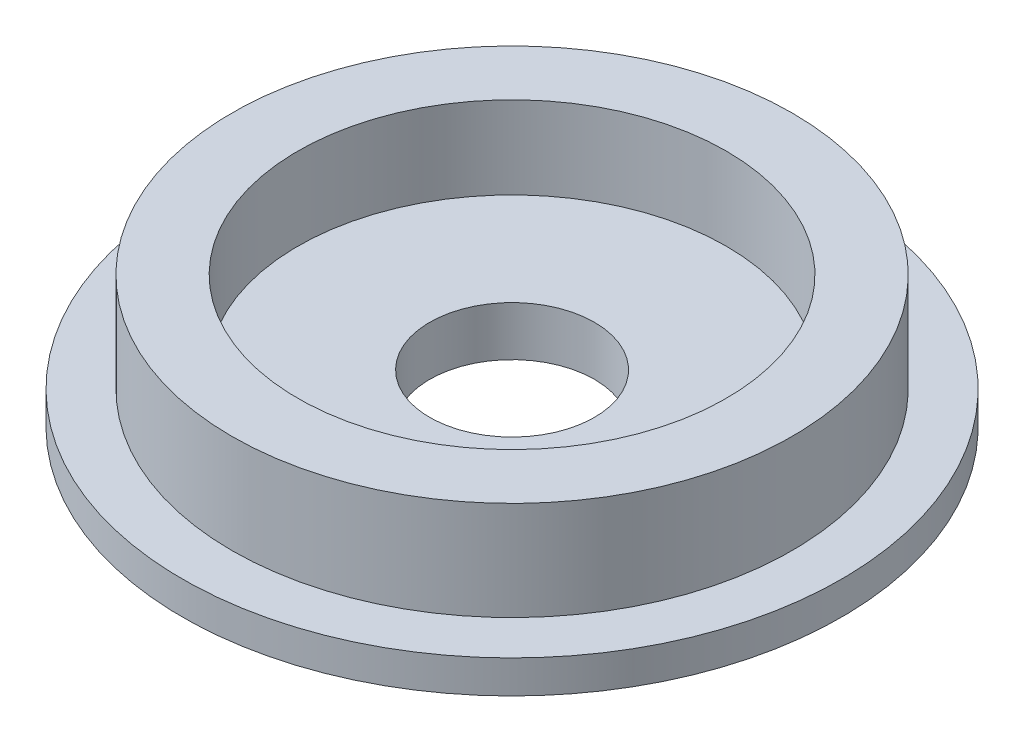
ISO-10303-21;
HEADER;
FILE_DESCRIPTION(('STEP AP214'),'2;1');
FILE_NAME('part.step','',(''),(''),'','','');
FILE_SCHEMA(('AUTOMOTIVE_DESIGN { 1 0 10303 214 1 1 1 1 }'));
ENDSEC;
DATA;
#1=APPLICATION_CONTEXT('core data for automotive mechanical design processes');
#2=APPLICATION_PROTOCOL_DEFINITION('international standard','automotive_design',2000,#1);
#3=PRODUCT_CONTEXT('',#1,'mechanical');
#4=PRODUCT('Part','Part','',(#3));
#5=PRODUCT_RELATED_PRODUCT_CATEGORY('part','',(#4));
#6=PRODUCT_DEFINITION_FORMATION('','',#4);
#7=PRODUCT_DEFINITION_CONTEXT('part definition',#1,'design');
#8=PRODUCT_DEFINITION('design','',#6,#7);
#9=PRODUCT_DEFINITION_SHAPE('','',#8);
#10=(LENGTH_UNIT() NAMED_UNIT(*) SI_UNIT(.MILLI.,.METRE.));
#11=(NAMED_UNIT(*) PLANE_ANGLE_UNIT() SI_UNIT($,.RADIAN.));
#12=(NAMED_UNIT(*) SI_UNIT($,.STERADIAN.) SOLID_ANGLE_UNIT());
#13=UNCERTAINTY_MEASURE_WITH_UNIT(LENGTH_MEASURE(1.E-05),#10,'distance_accuracy_value','');
#14=(GEOMETRIC_REPRESENTATION_CONTEXT(3) GLOBAL_UNCERTAINTY_ASSIGNED_CONTEXT((#13)) GLOBAL_UNIT_ASSIGNED_CONTEXT((#10,
#11,#12)) REPRESENTATION_CONTEXT('',''));
#15=CARTESIAN_POINT('',(0.,0.,0.));
#16=DIRECTION('',(0.,0.,1.));
#17=DIRECTION('',(1.,0.,0.));
#18=AXIS2_PLACEMENT_3D('',#15,#16,#17);
#19=CARTESIAN_POINT('',(0.,0.999999999999998,0.));
#20=DIRECTION('',(0.,1.,0.));
#21=DIRECTION('',(0.,0.,1.));
#22=AXIS2_PLACEMENT_3D('',#19,#20,#21);
#23=PLANE('',#22);
#24=CARTESIAN_POINT('',(0.,0.999999999999998,0.));
#25=DIRECTION('',(0.,-1.,0.));
#26=DIRECTION('',(0.,0.,-1.));
#27=AXIS2_PLACEMENT_3D('',#24,#25,#26);
#28=CIRCLE('',#27,8.5);
#29=CARTESIAN_POINT('',(0.,0.999999999999998,-8.5));
#30=VERTEX_POINT('',#29);
#31=EDGE_CURVE('E70',#30,#30,#28,.T.);
#32=ORIENTED_EDGE('',*,*,#31,.T.);
#33=EDGE_LOOP('',(#32));
#34=FACE_BOUND('',#33,.T.);
#35=CARTESIAN_POINT('',(0.,0.999999999999998,0.));
#36=DIRECTION('',(0.,-1.,0.));
#37=DIRECTION('',(0.,0.,-1.));
#38=AXIS2_PLACEMENT_3D('',#35,#36,#37);
#39=CIRCLE('',#38,10.);
#40=CARTESIAN_POINT('',(0.,0.999999999999998,-10.));
#41=VERTEX_POINT('',#40);
#42=EDGE_CURVE('E10',#41,#41,#39,.T.);
#43=ORIENTED_EDGE('',*,*,#42,.F.);
#44=EDGE_LOOP('',(#43));
#45=FACE_BOUND('',#44,.T.);
#46=ADVANCED_FACE('F34',(#34,#45),#23,.T.);
#47=CARTESIAN_POINT('',(0.,0.,0.));
#48=DIRECTION('',(0.,-1.,0.));
#49=DIRECTION('',(0.,0.,-1.));
#50=AXIS2_PLACEMENT_3D('',#47,#48,#49);
#51=CYLINDRICAL_SURFACE('',#50,10.);
#52=ORIENTED_EDGE('',*,*,#42,.T.);
#53=EDGE_LOOP('',(#52));
#54=FACE_BOUND('',#53,.T.);
#55=CARTESIAN_POINT('',(0.,0.,0.));
#56=DIRECTION('',(0.,-1.,0.));
#57=DIRECTION('',(0.,0.,-1.));
#58=AXIS2_PLACEMENT_3D('',#55,#56,#57);
#59=CIRCLE('',#58,10.);
#60=CARTESIAN_POINT('',(0.,0.,-10.));
#61=VERTEX_POINT('',#60);
#62=EDGE_CURVE('E41',#61,#61,#59,.T.);
#63=ORIENTED_EDGE('',*,*,#62,.F.);
#64=EDGE_LOOP('',(#63));
#65=FACE_BOUND('',#64,.T.);
#66=ADVANCED_FACE('F108',(#54,#65),#51,.T.);
#67=CARTESIAN_POINT('',(0.,0.,0.));
#68=DIRECTION('',(0.,-1.,0.));
#69=DIRECTION('',(0.,0.,-1.));
#70=AXIS2_PLACEMENT_3D('',#67,#68,#69);
#71=PLANE('',#70);
#72=ORIENTED_EDGE('',*,*,#62,.T.);
#73=EDGE_LOOP('',(#72));
#74=FACE_BOUND('',#73,.T.);
#75=CARTESIAN_POINT('',(0.,0.,0.));
#76=DIRECTION('',(0.,-1.,0.));
#77=DIRECTION('',(0.,0.,-1.));
#78=AXIS2_PLACEMENT_3D('',#75,#76,#77);
#79=CIRCLE('',#78,2.5);
#80=CARTESIAN_POINT('',(0.,0.,-2.5));
#81=VERTEX_POINT('',#80);
#82=EDGE_CURVE('E47',#81,#81,#79,.T.);
#83=ORIENTED_EDGE('',*,*,#82,.F.);
#84=EDGE_LOOP('',(#83));
#85=FACE_BOUND('',#84,.T.);
#86=ADVANCED_FACE('F103',(#74,#85),#71,.T.);
#87=CARTESIAN_POINT('',(0.,0.,0.));
#88=DIRECTION('',(0.,-1.,0.));
#89=DIRECTION('',(0.,0.,-1.));
#90=AXIS2_PLACEMENT_3D('',#87,#88,#89);
#91=CYLINDRICAL_SURFACE('',#90,2.5);
#92=CARTESIAN_POINT('',(0.,1.5,0.));
#93=DIRECTION('',(0.,-1.,0.));
#94=DIRECTION('',(0.,0.,-1.));
#95=AXIS2_PLACEMENT_3D('',#92,#93,#94);
#96=CIRCLE('',#95,2.5);
#97=CARTESIAN_POINT('',(0.,1.5,-2.5));
#98=VERTEX_POINT('',#97);
#99=EDGE_CURVE('E53',#98,#98,#96,.T.);
#100=ORIENTED_EDGE('',*,*,#99,.F.);
#101=EDGE_LOOP('',(#100));
#102=FACE_BOUND('',#101,.T.);
#103=ORIENTED_EDGE('',*,*,#82,.T.);
#104=EDGE_LOOP('',(#103));
#105=FACE_BOUND('',#104,.T.);
#106=ADVANCED_FACE('F97',(#102,#105),#91,.F.);
#107=CARTESIAN_POINT('',(0.,1.5,0.));
#108=DIRECTION('',(0.,-1.,0.));
#109=DIRECTION('',(0.,0.,-1.));
#110=AXIS2_PLACEMENT_3D('',#107,#108,#109);
#111=PLANE('',#110);
#112=CARTESIAN_POINT('',(0.,1.5,0.));
#113=DIRECTION('',(0.,-1.,0.));
#114=DIRECTION('',(0.,0.,-1.));
#115=AXIS2_PLACEMENT_3D('',#112,#113,#114);
#116=CIRCLE('',#115,6.5);
#117=CARTESIAN_POINT('',(0.,1.5,-6.5));
#118=VERTEX_POINT('',#117);
#119=EDGE_CURVE('E59',#118,#118,#116,.T.);
#120=ORIENTED_EDGE('',*,*,#119,.F.);
#121=EDGE_LOOP('',(#120));
#122=FACE_BOUND('',#121,.T.);
#123=ORIENTED_EDGE('',*,*,#99,.T.);
#124=EDGE_LOOP('',(#123));
#125=FACE_BOUND('',#124,.T.);
#126=ADVANCED_FACE('F91',(#122,#125),#111,.F.);
#127=CARTESIAN_POINT('',(0.,0.,0.));
#128=DIRECTION('',(0.,-1.,0.));
#129=DIRECTION('',(0.,0.,-1.));
#130=AXIS2_PLACEMENT_3D('',#127,#128,#129);
#131=CYLINDRICAL_SURFACE('',#130,6.5);
#132=CARTESIAN_POINT('',(0.,4.,0.));
#133=DIRECTION('',(0.,-1.,0.));
#134=DIRECTION('',(0.,0.,-1.));
#135=AXIS2_PLACEMENT_3D('',#132,#133,#134);
#136=CIRCLE('',#135,6.5);
#137=CARTESIAN_POINT('',(0.,4.,-6.5));
#138=VERTEX_POINT('',#137);
#139=EDGE_CURVE('E63',#138,#138,#136,.T.);
#140=ORIENTED_EDGE('',*,*,#139,.F.);
#141=EDGE_LOOP('',(#140));
#142=FACE_BOUND('',#141,.T.);
#143=ORIENTED_EDGE('',*,*,#119,.T.);
#144=EDGE_LOOP('',(#143));
#145=FACE_BOUND('',#144,.T.);
#146=ADVANCED_FACE('F85',(#142,#145),#131,.F.);
#147=CARTESIAN_POINT('',(0.,4.,0.));
#148=DIRECTION('',(0.,-1.,0.));
#149=DIRECTION('',(0.,0.,-1.));
#150=AXIS2_PLACEMENT_3D('',#147,#148,#149);
#151=PLANE('',#150);
#152=CARTESIAN_POINT('',(0.,4.,0.));
#153=DIRECTION('',(0.,-1.,0.));
#154=DIRECTION('',(0.,0.,-1.));
#155=AXIS2_PLACEMENT_3D('',#152,#153,#154);
#156=CIRCLE('',#155,8.5);
#157=CARTESIAN_POINT('',(0.,4.,-8.5));
#158=VERTEX_POINT('',#157);
#159=EDGE_CURVE('E67',#158,#158,#156,.T.);
#160=ORIENTED_EDGE('',*,*,#159,.F.);
#161=EDGE_LOOP('',(#160));
#162=FACE_BOUND('',#161,.T.);
#163=ORIENTED_EDGE('',*,*,#139,.T.);
#164=EDGE_LOOP('',(#163));
#165=FACE_BOUND('',#164,.T.);
#166=ADVANCED_FACE('F79',(#162,#165),#151,.F.);
#167=CARTESIAN_POINT('',(0.,0.,0.));
#168=DIRECTION('',(0.,-1.,0.));
#169=DIRECTION('',(0.,0.,-1.));
#170=AXIS2_PLACEMENT_3D('',#167,#168,#169);
#171=CYLINDRICAL_SURFACE('',#170,8.5);
#172=ORIENTED_EDGE('',*,*,#31,.F.);
#173=EDGE_LOOP('',(#172));
#174=FACE_BOUND('',#173,.T.);
#175=ORIENTED_EDGE('',*,*,#159,.T.);
#176=EDGE_LOOP('',(#175));
#177=FACE_BOUND('',#176,.T.);
#178=ADVANCED_FACE('F76',(#174,#177),#171,.T.);
#179=CLOSED_SHELL('',(#46,#66,#86,#106,#126,#146,#166,#178));
#180=MANIFOLD_SOLID_BREP('B2',#179);
#181=ADVANCED_BREP_SHAPE_REPRESENTATION('',(#18,#180),#14);
#182=SHAPE_DEFINITION_REPRESENTATION(#9,#181);
ENDSEC;
END-ISO-10303-21;
